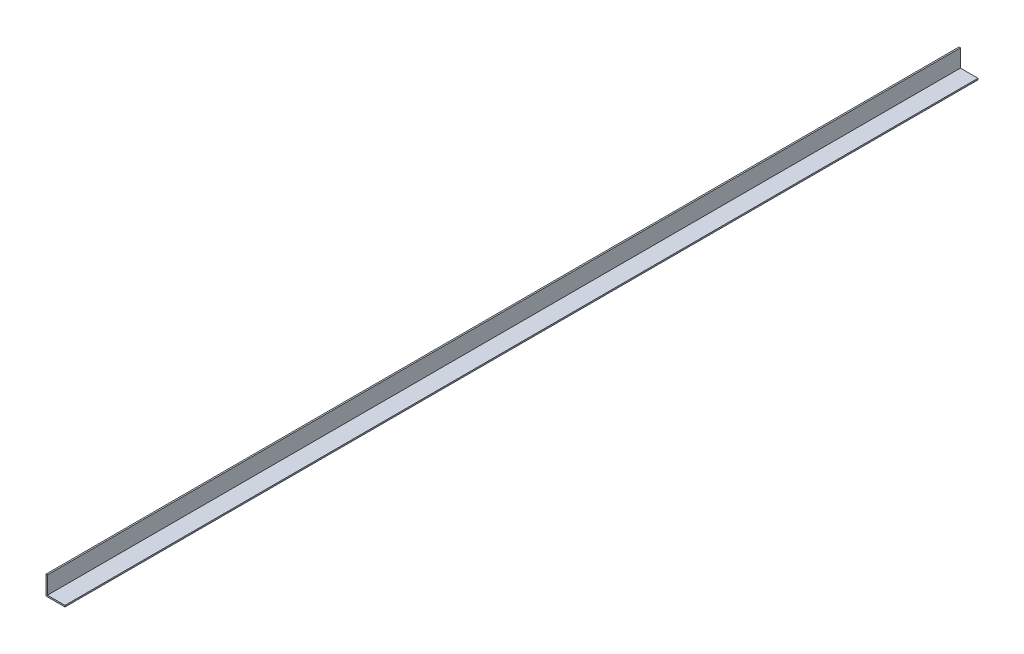
ISO-10303-21;
HEADER;
FILE_DESCRIPTION(('STEP AP214'),'2;1');
FILE_NAME('part.step','',(''),(''),'','','');
FILE_SCHEMA(('AUTOMOTIVE_DESIGN { 1 0 10303 214 1 1 1 1 }'));
ENDSEC;
DATA;
#1=APPLICATION_CONTEXT('core data for automotive mechanical design processes');
#2=APPLICATION_PROTOCOL_DEFINITION('international standard','automotive_design',2000,#1);
#3=PRODUCT_CONTEXT('',#1,'mechanical');
#4=PRODUCT('Part','Part','',(#3));
#5=PRODUCT_RELATED_PRODUCT_CATEGORY('part','',(#4));
#6=PRODUCT_DEFINITION_FORMATION('','',#4);
#7=PRODUCT_DEFINITION_CONTEXT('part definition',#1,'design');
#8=PRODUCT_DEFINITION('design','',#6,#7);
#9=PRODUCT_DEFINITION_SHAPE('','',#8);
#10=(LENGTH_UNIT() NAMED_UNIT(*) SI_UNIT(.MILLI.,.METRE.));
#11=(NAMED_UNIT(*) PLANE_ANGLE_UNIT() SI_UNIT($,.RADIAN.));
#12=(NAMED_UNIT(*) SI_UNIT($,.STERADIAN.) SOLID_ANGLE_UNIT());
#13=UNCERTAINTY_MEASURE_WITH_UNIT(LENGTH_MEASURE(1.E-05),#10,'distance_accuracy_value','');
#14=(GEOMETRIC_REPRESENTATION_CONTEXT(3) GLOBAL_UNCERTAINTY_ASSIGNED_CONTEXT((#13)) GLOBAL_UNIT_ASSIGNED_CONTEXT((#10,
#11,#12)) REPRESENTATION_CONTEXT('',''));
#15=CARTESIAN_POINT('',(0.,0.,0.));
#16=DIRECTION('',(0.,0.,1.));
#17=DIRECTION('',(1.,0.,0.));
#18=AXIS2_PLACEMENT_3D('',#15,#16,#17);
#19=CARTESIAN_POINT('',(9.53,127.,-6100.));
#20=DIRECTION('',(0.,1.,0.));
#21=DIRECTION('',(0.,0.,1.));
#22=AXIS2_PLACEMENT_3D('',#19,#20,#21);
#23=PLANE('',#22);
#24=DIRECTION('',(-1.,0.,0.));
#25=VECTOR('',#24,1.);
#26=CARTESIAN_POINT('',(9.53,127.,0.));
#27=LINE('',#26,#25);
#28=CARTESIAN_POINT('',(9.53,127.,0.));
#29=VERTEX_POINT('',#28);
#30=CARTESIAN_POINT('',(0.,127.,0.));
#31=VERTEX_POINT('',#30);
#32=EDGE_CURVE('E118',#29,#31,#27,.T.);
#33=ORIENTED_EDGE('',*,*,#32,.F.);
#34=DIRECTION('',(0.,0.,1.));
#35=VECTOR('',#34,1.);
#36=CARTESIAN_POINT('',(9.53,127.,-6100.));
#37=LINE('',#36,#35);
#38=CARTESIAN_POINT('',(9.53,127.,-6100.));
#39=VERTEX_POINT('',#38);
#40=EDGE_CURVE('E11',#39,#29,#37,.T.);
#41=ORIENTED_EDGE('',*,*,#40,.F.);
#42=DIRECTION('',(-1.,0.,0.));
#43=VECTOR('',#42,1.);
#44=CARTESIAN_POINT('',(9.53,127.,-6100.));
#45=LINE('',#44,#43);
#46=CARTESIAN_POINT('',(0.,127.,-6100.));
#47=VERTEX_POINT('',#46);
#48=EDGE_CURVE('E132',#39,#47,#45,.T.);
#49=ORIENTED_EDGE('',*,*,#48,.T.);
#50=DIRECTION('',(0.,0.,1.));
#51=VECTOR('',#50,1.);
#52=CARTESIAN_POINT('',(0.,127.,-6100.));
#53=LINE('',#52,#51);
#54=EDGE_CURVE('E36',#47,#31,#53,.T.);
#55=ORIENTED_EDGE('',*,*,#54,.T.);
#56=EDGE_LOOP('',(#33,#41,#49,#55));
#57=FACE_BOUND('',#56,.T.);
#58=ADVANCED_FACE('F33',(#57),#23,.T.);
#59=CARTESIAN_POINT('',(9.53,9.52999999999999,-6100.));
#60=DIRECTION('',(1.,0.,0.));
#61=DIRECTION('',(0.,1.,0.));
#62=AXIS2_PLACEMENT_3D('',#59,#60,#61);
#63=PLANE('',#62);
#64=DIRECTION('',(0.,1.,0.));
#65=VECTOR('',#64,1.);
#66=CARTESIAN_POINT('',(9.53,9.52999999999999,0.));
#67=LINE('',#66,#65);
#68=CARTESIAN_POINT('',(9.53,9.52999999999999,0.));
#69=VERTEX_POINT('',#68);
#70=EDGE_CURVE('E130',#69,#29,#67,.T.);
#71=ORIENTED_EDGE('',*,*,#70,.F.);
#72=DIRECTION('',(0.,0.,1.));
#73=VECTOR('',#72,1.);
#74=CARTESIAN_POINT('',(9.53,9.52999999999999,-6100.));
#75=LINE('',#74,#73);
#76=CARTESIAN_POINT('',(9.53,9.52999999999999,-6100.));
#77=VERTEX_POINT('',#76);
#78=EDGE_CURVE('E42',#77,#69,#75,.T.);
#79=ORIENTED_EDGE('',*,*,#78,.F.);
#80=DIRECTION('',(0.,1.,0.));
#81=VECTOR('',#80,1.);
#82=CARTESIAN_POINT('',(9.53,9.52999999999999,-6100.));
#83=LINE('',#82,#81);
#84=EDGE_CURVE('E108',#77,#39,#83,.T.);
#85=ORIENTED_EDGE('',*,*,#84,.T.);
#86=ORIENTED_EDGE('',*,*,#40,.T.);
#87=EDGE_LOOP('',(#71,#79,#85,#86));
#88=FACE_BOUND('',#87,.T.);
#89=ADVANCED_FACE('F140',(#88),#63,.T.);
#90=CARTESIAN_POINT('',(127.,9.53,-6100.));
#91=DIRECTION('',(0.,1.,0.));
#92=DIRECTION('',(-1.,0.,0.));
#93=AXIS2_PLACEMENT_3D('',#90,#91,#92);
#94=PLANE('',#93);
#95=DIRECTION('',(-1.,0.,0.));
#96=VECTOR('',#95,1.);
#97=CARTESIAN_POINT('',(127.,9.53,0.));
#98=LINE('',#97,#96);
#99=CARTESIAN_POINT('',(127.,9.53,0.));
#100=VERTEX_POINT('',#99);
#101=EDGE_CURVE('E95',#100,#69,#98,.T.);
#102=ORIENTED_EDGE('',*,*,#101,.F.);
#103=DIRECTION('',(0.,0.,1.));
#104=VECTOR('',#103,1.);
#105=CARTESIAN_POINT('',(127.,9.53,-6100.));
#106=LINE('',#105,#104);
#107=CARTESIAN_POINT('',(127.,9.53,-6100.));
#108=VERTEX_POINT('',#107);
#109=EDGE_CURVE('E90',#108,#100,#106,.T.);
#110=ORIENTED_EDGE('',*,*,#109,.F.);
#111=DIRECTION('',(-1.,0.,0.));
#112=VECTOR('',#111,1.);
#113=CARTESIAN_POINT('',(127.,9.53,-6100.));
#114=LINE('',#113,#112);
#115=EDGE_CURVE('E93',#108,#77,#114,.T.);
#116=ORIENTED_EDGE('',*,*,#115,.T.);
#117=ORIENTED_EDGE('',*,*,#78,.T.);
#118=EDGE_LOOP('',(#102,#110,#116,#117));
#119=FACE_BOUND('',#118,.T.);
#120=ADVANCED_FACE('F92',(#119),#94,.T.);
#121=CARTESIAN_POINT('',(127.,0.,-6100.));
#122=DIRECTION('',(1.,0.,0.));
#123=DIRECTION('',(0.,0.,-1.));
#124=AXIS2_PLACEMENT_3D('',#121,#122,#123);
#125=PLANE('',#124);
#126=DIRECTION('',(0.,1.,0.));
#127=VECTOR('',#126,1.);
#128=CARTESIAN_POINT('',(127.,0.,0.));
#129=LINE('',#128,#127);
#130=CARTESIAN_POINT('',(127.,0.,0.));
#131=VERTEX_POINT('',#130);
#132=EDGE_CURVE('E127',#131,#100,#129,.T.);
#133=ORIENTED_EDGE('',*,*,#132,.F.);
#134=DIRECTION('',(0.,0.,1.));
#135=VECTOR('',#134,1.);
#136=CARTESIAN_POINT('',(127.,0.,-6100.));
#137=LINE('',#136,#135);
#138=CARTESIAN_POINT('',(127.,0.,-6100.));
#139=VERTEX_POINT('',#138);
#140=EDGE_CURVE('E100',#139,#131,#137,.T.);
#141=ORIENTED_EDGE('',*,*,#140,.F.);
#142=DIRECTION('',(0.,1.,0.));
#143=VECTOR('',#142,1.);
#144=CARTESIAN_POINT('',(127.,0.,-6100.));
#145=LINE('',#144,#143);
#146=EDGE_CURVE('E106',#139,#108,#145,.T.);
#147=ORIENTED_EDGE('',*,*,#146,.T.);
#148=ORIENTED_EDGE('',*,*,#109,.T.);
#149=EDGE_LOOP('',(#133,#141,#147,#148));
#150=FACE_BOUND('',#149,.T.);
#151=ADVANCED_FACE('F110',(#150),#125,.T.);
#152=CARTESIAN_POINT('',(0.,0.,-6100.));
#153=DIRECTION('',(0.,-1.,0.));
#154=DIRECTION('',(0.,0.,-1.));
#155=AXIS2_PLACEMENT_3D('',#152,#153,#154);
#156=PLANE('',#155);
#157=DIRECTION('',(1.,0.,0.));
#158=VECTOR('',#157,1.);
#159=CARTESIAN_POINT('',(0.,0.,0.));
#160=LINE('',#159,#158);
#161=CARTESIAN_POINT('',(0.,0.,0.));
#162=VERTEX_POINT('',#161);
#163=EDGE_CURVE('E124',#162,#131,#160,.T.);
#164=ORIENTED_EDGE('',*,*,#163,.F.);
#165=DIRECTION('',(0.,0.,1.));
#166=VECTOR('',#165,1.);
#167=CARTESIAN_POINT('',(0.,0.,-6100.));
#168=LINE('',#167,#166);
#169=CARTESIAN_POINT('',(0.,0.,-6100.));
#170=VERTEX_POINT('',#169);
#171=EDGE_CURVE('E135',#170,#162,#168,.T.);
#172=ORIENTED_EDGE('',*,*,#171,.F.);
#173=DIRECTION('',(1.,0.,0.));
#174=VECTOR('',#173,1.);
#175=CARTESIAN_POINT('',(0.,0.,-6100.));
#176=LINE('',#175,#174);
#177=EDGE_CURVE('E111',#170,#139,#176,.T.);
#178=ORIENTED_EDGE('',*,*,#177,.T.);
#179=ORIENTED_EDGE('',*,*,#140,.T.);
#180=EDGE_LOOP('',(#164,#172,#178,#179));
#181=FACE_BOUND('',#180,.T.);
#182=ADVANCED_FACE('F153',(#181),#156,.T.);
#183=CARTESIAN_POINT('',(0.,127.,-6100.));
#184=DIRECTION('',(-1.,0.,0.));
#185=DIRECTION('',(0.,-1.,0.));
#186=AXIS2_PLACEMENT_3D('',#183,#184,#185);
#187=PLANE('',#186);
#188=DIRECTION('',(0.,-1.,0.));
#189=VECTOR('',#188,1.);
#190=CARTESIAN_POINT('',(0.,127.,0.));
#191=LINE('',#190,#189);
#192=EDGE_CURVE('E121',#31,#162,#191,.T.);
#193=ORIENTED_EDGE('',*,*,#192,.F.);
#194=ORIENTED_EDGE('',*,*,#54,.F.);
#195=DIRECTION('',(0.,-1.,0.));
#196=VECTOR('',#195,1.);
#197=CARTESIAN_POINT('',(0.,127.,-6100.));
#198=LINE('',#197,#196);
#199=EDGE_CURVE('E113',#47,#170,#198,.T.);
#200=ORIENTED_EDGE('',*,*,#199,.T.);
#201=ORIENTED_EDGE('',*,*,#171,.T.);
#202=EDGE_LOOP('',(#193,#194,#200,#201));
#203=FACE_BOUND('',#202,.T.);
#204=ADVANCED_FACE('F137',(#203),#187,.T.);
#205=CARTESIAN_POINT('',(0.,0.,-6100.));
#206=DIRECTION('',(0.,0.,1.));
#207=DIRECTION('',(1.,0.,0.));
#208=AXIS2_PLACEMENT_3D('',#205,#206,#207);
#209=PLANE('',#208);
#210=ORIENTED_EDGE('',*,*,#48,.F.);
#211=ORIENTED_EDGE('',*,*,#84,.F.);
#212=ORIENTED_EDGE('',*,*,#115,.F.);
#213=ORIENTED_EDGE('',*,*,#146,.F.);
#214=ORIENTED_EDGE('',*,*,#177,.F.);
#215=ORIENTED_EDGE('',*,*,#199,.F.);
#216=EDGE_LOOP('',(#210,#211,#212,#213,#214,#215));
#217=FACE_BOUND('',#216,.T.);
#218=ADVANCED_FACE('F104',(#217),#209,.F.);
#219=CARTESIAN_POINT('',(0.,0.,0.));
#220=DIRECTION('',(0.,0.,1.));
#221=DIRECTION('',(1.,0.,0.));
#222=AXIS2_PLACEMENT_3D('',#219,#220,#221);
#223=PLANE('',#222);
#224=ORIENTED_EDGE('',*,*,#32,.T.);
#225=ORIENTED_EDGE('',*,*,#192,.T.);
#226=ORIENTED_EDGE('',*,*,#163,.T.);
#227=ORIENTED_EDGE('',*,*,#132,.T.);
#228=ORIENTED_EDGE('',*,*,#101,.T.);
#229=ORIENTED_EDGE('',*,*,#70,.T.);
#230=EDGE_LOOP('',(#224,#225,#226,#227,#228,#229));
#231=FACE_BOUND('',#230,.T.);
#232=ADVANCED_FACE('F139',(#231),#223,.T.);
#233=CLOSED_SHELL('',(#58,#89,#120,#151,#182,#204,#218,#232));
#234=MANIFOLD_SOLID_BREP('B2',#233);
#235=ADVANCED_BREP_SHAPE_REPRESENTATION('',(#18,#234),#14);
#236=SHAPE_DEFINITION_REPRESENTATION(#9,#235);
ENDSEC;
END-ISO-10303-21;
